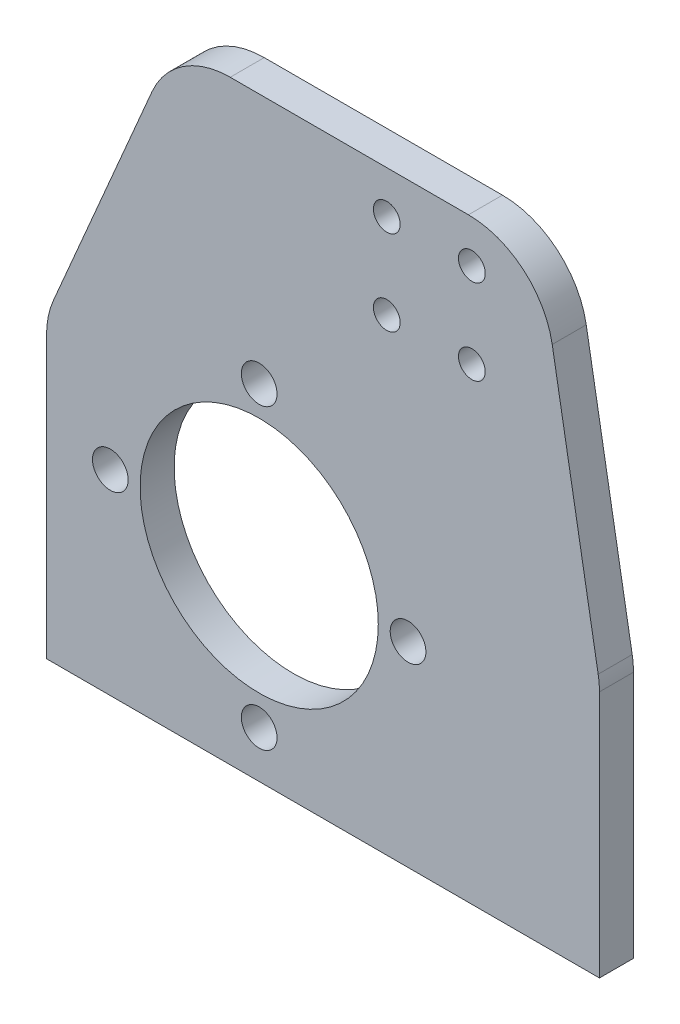
ISO-10303-21;
HEADER;
FILE_DESCRIPTION(('STEP AP214'),'2;1');
FILE_NAME('part.step','',(''),(''),'','','');
FILE_SCHEMA(('AUTOMOTIVE_DESIGN { 1 0 10303 214 1 1 1 1 }'));
ENDSEC;
DATA;
#1=APPLICATION_CONTEXT('core data for automotive mechanical design processes');
#2=APPLICATION_PROTOCOL_DEFINITION('international standard','automotive_design',2000,#1);
#3=PRODUCT_CONTEXT('',#1,'mechanical');
#4=PRODUCT('Part','Part','',(#3));
#5=PRODUCT_RELATED_PRODUCT_CATEGORY('part','',(#4));
#6=PRODUCT_DEFINITION_FORMATION('','',#4);
#7=PRODUCT_DEFINITION_CONTEXT('part definition',#1,'design');
#8=PRODUCT_DEFINITION('design','',#6,#7);
#9=PRODUCT_DEFINITION_SHAPE('','',#8);
#10=(LENGTH_UNIT() NAMED_UNIT(*) SI_UNIT(.MILLI.,.METRE.));
#11=(NAMED_UNIT(*) PLANE_ANGLE_UNIT() SI_UNIT($,.RADIAN.));
#12=(NAMED_UNIT(*) SI_UNIT($,.STERADIAN.) SOLID_ANGLE_UNIT());
#13=UNCERTAINTY_MEASURE_WITH_UNIT(LENGTH_MEASURE(1.E-05),#10,'distance_accuracy_value','');
#14=(GEOMETRIC_REPRESENTATION_CONTEXT(3) GLOBAL_UNCERTAINTY_ASSIGNED_CONTEXT((#13)) GLOBAL_UNIT_ASSIGNED_CONTEXT((#10,
#11,#12)) REPRESENTATION_CONTEXT('',''));
#15=CARTESIAN_POINT('',(0.,0.,0.));
#16=DIRECTION('',(0.,0.,1.));
#17=DIRECTION('',(1.,0.,0.));
#18=AXIS2_PLACEMENT_3D('',#15,#16,#17);
#19=CARTESIAN_POINT('',(0.,0.,4.));
#20=DIRECTION('',(1.,0.,0.));
#21=DIRECTION('',(0.,1.,0.));
#22=AXIS2_PLACEMENT_3D('',#19,#20,#21);
#23=PLANE('',#22);
#24=DIRECTION('',(0.,-1.,0.));
#25=VECTOR('',#24,1.);
#26=CARTESIAN_POINT('',(0.,0.,4.));
#27=LINE('',#26,#25);
#28=CARTESIAN_POINT('',(0.,-37.0525770195464,4.));
#29=VERTEX_POINT('',#28);
#30=CARTESIAN_POINT('',(0.,-70.,4.));
#31=VERTEX_POINT('',#30);
#32=EDGE_CURVE('E116',#29,#31,#27,.T.);
#33=ORIENTED_EDGE('',*,*,#32,.F.);
#34=DIRECTION('',(0.,0.,-1.));
#35=VECTOR('',#34,1.);
#36=CARTESIAN_POINT('',(0.,-37.0525770195464,4.));
#37=LINE('',#36,#35);
#38=CARTESIAN_POINT('',(0.,-37.0525770195464,0.));
#39=VERTEX_POINT('',#38);
#40=EDGE_CURVE('E174',#29,#39,#37,.T.);
#41=ORIENTED_EDGE('',*,*,#40,.T.);
#42=DIRECTION('',(0.,-1.,0.));
#43=VECTOR('',#42,1.);
#44=CARTESIAN_POINT('',(0.,0.,0.));
#45=LINE('',#44,#43);
#46=CARTESIAN_POINT('',(0.,-70.,0.));
#47=VERTEX_POINT('',#46);
#48=EDGE_CURVE('E142',#39,#47,#45,.T.);
#49=ORIENTED_EDGE('',*,*,#48,.T.);
#50=DIRECTION('',(0.,0.,-1.));
#51=VECTOR('',#50,1.);
#52=CARTESIAN_POINT('',(0.,-70.,4.));
#53=LINE('',#52,#51);
#54=EDGE_CURVE('E135',#31,#47,#53,.T.);
#55=ORIENTED_EDGE('',*,*,#54,.F.);
#56=EDGE_LOOP('',(#33,#41,#49,#55));
#57=FACE_BOUND('',#56,.T.);
#58=ADVANCED_FACE('F40',(#57),#23,.F.);
#59=CARTESIAN_POINT('',(0.,-70.,4.));
#60=DIRECTION('',(0.,1.,0.));
#61=DIRECTION('',(0.,0.,1.));
#62=AXIS2_PLACEMENT_3D('',#59,#60,#61);
#63=PLANE('',#62);
#64=DIRECTION('',(1.,0.,0.));
#65=VECTOR('',#64,1.);
#66=CARTESIAN_POINT('',(0.,-70.,0.));
#67=LINE('',#66,#65);
#68=CARTESIAN_POINT('',(65.,-70.,0.));
#69=VERTEX_POINT('',#68);
#70=EDGE_CURVE('E256',#47,#69,#67,.T.);
#71=ORIENTED_EDGE('',*,*,#70,.T.);
#72=DIRECTION('',(0.,0.,-1.));
#73=VECTOR('',#72,1.);
#74=CARTESIAN_POINT('',(65.,-70.,4.));
#75=LINE('',#74,#73);
#76=CARTESIAN_POINT('',(65.,-70.,4.));
#77=VERTEX_POINT('',#76);
#78=EDGE_CURVE('E137',#77,#69,#75,.T.);
#79=ORIENTED_EDGE('',*,*,#78,.F.);
#80=DIRECTION('',(1.,0.,0.));
#81=VECTOR('',#80,1.);
#82=CARTESIAN_POINT('',(0.,-70.,4.));
#83=LINE('',#82,#81);
#84=EDGE_CURVE('E121',#31,#77,#83,.T.);
#85=ORIENTED_EDGE('',*,*,#84,.F.);
#86=ORIENTED_EDGE('',*,*,#54,.T.);
#87=EDGE_LOOP('',(#71,#79,#85,#86));
#88=FACE_BOUND('',#87,.T.);
#89=ADVANCED_FACE('F134',(#88),#63,.F.);
#90=CARTESIAN_POINT('',(65.,0.,4.));
#91=DIRECTION('',(-1.,0.,0.));
#92=DIRECTION('',(0.,-1.,0.));
#93=AXIS2_PLACEMENT_3D('',#90,#91,#92);
#94=PLANE('',#93);
#95=DIRECTION('',(0.,1.,0.));
#96=VECTOR('',#95,1.);
#97=CARTESIAN_POINT('',(65.,0.,0.));
#98=LINE('',#97,#96);
#99=CARTESIAN_POINT('',(65.,-40.8684014407056,0.));
#100=VERTEX_POINT('',#99);
#101=EDGE_CURVE('E258',#69,#100,#98,.T.);
#102=ORIENTED_EDGE('',*,*,#101,.T.);
#103=DIRECTION('',(0.,0.,-1.));
#104=VECTOR('',#103,1.);
#105=CARTESIAN_POINT('',(65.,-40.8684014407056,4.));
#106=LINE('',#105,#104);
#107=CARTESIAN_POINT('',(65.,-40.8684014407056,4.));
#108=VERTEX_POINT('',#107);
#109=EDGE_CURVE('E162',#100,#108,#106,.F.);
#110=ORIENTED_EDGE('',*,*,#109,.T.);
#111=DIRECTION('',(0.,1.,0.));
#112=VECTOR('',#111,1.);
#113=CARTESIAN_POINT('',(65.,0.,4.));
#114=LINE('',#113,#112);
#115=EDGE_CURVE('E139',#77,#108,#114,.T.);
#116=ORIENTED_EDGE('',*,*,#115,.F.);
#117=ORIENTED_EDGE('',*,*,#78,.T.);
#118=EDGE_LOOP('',(#102,#110,#116,#117));
#119=FACE_BOUND('',#118,.T.);
#120=ADVANCED_FACE('F275',(#119),#94,.F.);
#121=CARTESIAN_POINT('',(0.,0.,4.));
#122=DIRECTION('',(0.,-1.,0.));
#123=DIRECTION('',(0.,0.,-1.));
#124=AXIS2_PLACEMENT_3D('',#121,#122,#123);
#125=PLANE('',#124);
#126=DIRECTION('',(-1.,0.,0.));
#127=VECTOR('',#126,1.);
#128=CARTESIAN_POINT('',(0.,0.,4.));
#129=LINE('',#128,#127);
#130=CARTESIAN_POINT('',(49.5980297478765,0.,4.));
#131=VERTEX_POINT('',#130);
#132=CARTESIAN_POINT('',(21.5939615798056,0.,4.));
#133=VERTEX_POINT('',#132);
#134=EDGE_CURVE('E148',#131,#133,#129,.T.);
#135=ORIENTED_EDGE('',*,*,#134,.F.);
#136=DIRECTION('',(0.,0.,-1.));
#137=VECTOR('',#136,1.);
#138=CARTESIAN_POINT('',(49.5980297478765,0.,4.));
#139=LINE('',#138,#137);
#140=CARTESIAN_POINT('',(49.5980297478765,0.,0.));
#141=VERTEX_POINT('',#140);
#142=EDGE_CURVE('E171',#131,#141,#139,.T.);
#143=ORIENTED_EDGE('',*,*,#142,.T.);
#144=DIRECTION('',(-1.,0.,0.));
#145=VECTOR('',#144,1.);
#146=CARTESIAN_POINT('',(0.,0.,0.));
#147=LINE('',#146,#145);
#148=CARTESIAN_POINT('',(21.5939615798056,0.,0.));
#149=VERTEX_POINT('',#148);
#150=EDGE_CURVE('E130',#141,#149,#147,.T.);
#151=ORIENTED_EDGE('',*,*,#150,.T.);
#152=DIRECTION('',(0.,0.,-1.));
#153=VECTOR('',#152,1.);
#154=CARTESIAN_POINT('',(21.5939615798056,0.,4.));
#155=LINE('',#154,#153);
#156=EDGE_CURVE('E55',#149,#133,#155,.F.);
#157=ORIENTED_EDGE('',*,*,#156,.T.);
#158=EDGE_LOOP('',(#135,#143,#151,#157));
#159=FACE_BOUND('',#158,.T.);
#160=ADVANCED_FACE('F260',(#159),#125,.F.);
#161=CARTESIAN_POINT('',(0.,0.,4.));
#162=DIRECTION('',(0.,0.,1.));
#163=DIRECTION('',(1.,0.,0.));
#164=AXIS2_PLACEMENT_3D('',#161,#162,#163);
#165=PLANE('',#164);
#166=ORIENTED_EDGE('',*,*,#115,.T.);
#167=CARTESIAN_POINT('',(55.,-40.8684014407056,4.));
#168=DIRECTION('',(0.,0.,1.));
#169=DIRECTION('',(1.,0.,0.));
#170=AXIS2_PLACEMENT_3D('',#167,#168,#169);
#171=CIRCLE('',#170,10.);
#172=CARTESIAN_POINT('',(64.8503046715571,-39.1445981231831,4.));
#173=VERTEX_POINT('',#172);
#174=EDGE_CURVE('E168',#108,#173,#171,.T.);
#175=ORIENTED_EDGE('',*,*,#174,.T.);
#176=DIRECTION('',(-0.172380331752248,0.985030467155704,0.));
#177=VECTOR('',#176,1.);
#178=CARTESIAN_POINT('',(58.,0.,4.));
#179=LINE('',#178,#177);
#180=CARTESIAN_POINT('',(59.4483344194336,-8.27619668247752,4.));
#181=VERTEX_POINT('',#180);
#182=EDGE_CURVE('E196',#173,#181,#179,.T.);
#183=ORIENTED_EDGE('',*,*,#182,.T.);
#184=CARTESIAN_POINT('',(49.5980297478765,-10.,4.));
#185=DIRECTION('',(0.,0.,1.));
#186=DIRECTION('',(1.,0.,0.));
#187=AXIS2_PLACEMENT_3D('',#184,#185,#186);
#188=CIRCLE('',#187,10.);
#189=EDGE_CURVE('E62',#181,#131,#188,.T.);
#190=ORIENTED_EDGE('',*,*,#189,.T.);
#191=ORIENTED_EDGE('',*,*,#134,.T.);
#192=CARTESIAN_POINT('',(21.5939615798056,-10.,4.));
#193=DIRECTION('',(0.,0.,1.));
#194=DIRECTION('',(1.,0.,0.));
#195=AXIS2_PLACEMENT_3D('',#192,#193,#194);
#196=CIRCLE('',#195,10.);
#197=CARTESIAN_POINT('',(12.402511279625,-6.06080701420832,4.));
#198=VERTEX_POINT('',#197);
#199=EDGE_CURVE('E164',#133,#198,#196,.T.);
#200=ORIENTED_EDGE('',*,*,#199,.T.);
#201=DIRECTION('',(-0.393919298579168,-0.919145030018058,0.));
#202=VECTOR('',#201,1.);
#203=CARTESIAN_POINT('',(0.,-35.,4.));
#204=LINE('',#203,#202);
#205=CARTESIAN_POINT('',(0.808549699819426,-33.1133840337547,4.));
#206=VERTEX_POINT('',#205);
#207=EDGE_CURVE('E184',#198,#206,#204,.T.);
#208=ORIENTED_EDGE('',*,*,#207,.T.);
#209=CARTESIAN_POINT('',(10.,-37.0525770195464,4.));
#210=DIRECTION('',(0.,0.,1.));
#211=DIRECTION('',(1.,0.,0.));
#212=AXIS2_PLACEMENT_3D('',#209,#210,#211);
#213=CIRCLE('',#212,10.);
#214=EDGE_CURVE('E125',#206,#29,#213,.T.);
#215=ORIENTED_EDGE('',*,*,#214,.T.);
#216=ORIENTED_EDGE('',*,*,#32,.T.);
#217=ORIENTED_EDGE('',*,*,#84,.T.);
#218=EDGE_LOOP('',(#166,#175,#183,#190,#191,#200,#208,#215,#216,#217));
#219=FACE_BOUND('',#218,.T.);
#220=CARTESIAN_POINT('',(7.50000000000002,-47.,4.));
#221=DIRECTION('',(0.,0.,1.));
#222=DIRECTION('',(1.,0.,0.));
#223=AXIS2_PLACEMENT_3D('',#220,#221,#222);
#224=CIRCLE('',#223,2.1);
#225=CARTESIAN_POINT('',(9.60000000000002,-47.,4.));
#226=VERTEX_POINT('',#225);
#227=EDGE_CURVE('E224',#226,#226,#224,.T.);
#228=ORIENTED_EDGE('',*,*,#227,.F.);
#229=EDGE_LOOP('',(#228));
#230=FACE_BOUND('',#229,.T.);
#231=CARTESIAN_POINT('',(25.,-64.5,4.));
#232=DIRECTION('',(0.,0.,1.));
#233=DIRECTION('',(-1.,0.,0.));
#234=AXIS2_PLACEMENT_3D('',#231,#232,#233);
#235=CIRCLE('',#234,2.1);
#236=CARTESIAN_POINT('',(22.9,-64.5,4.));
#237=VERTEX_POINT('',#236);
#238=EDGE_CURVE('E231',#237,#237,#235,.T.);
#239=ORIENTED_EDGE('',*,*,#238,.F.);
#240=EDGE_LOOP('',(#239));
#241=FACE_BOUND('',#240,.T.);
#242=CARTESIAN_POINT('',(42.5,-47.,4.));
#243=DIRECTION('',(0.,0.,1.));
#244=DIRECTION('',(-1.,0.,0.));
#245=AXIS2_PLACEMENT_3D('',#242,#243,#244);
#246=CIRCLE('',#245,2.1);
#247=CARTESIAN_POINT('',(40.4,-47.,4.));
#248=VERTEX_POINT('',#247);
#249=EDGE_CURVE('E237',#248,#248,#246,.T.);
#250=ORIENTED_EDGE('',*,*,#249,.F.);
#251=EDGE_LOOP('',(#250));
#252=FACE_BOUND('',#251,.T.);
#253=CARTESIAN_POINT('',(40.,-5.,4.));
#254=DIRECTION('',(0.,0.,1.));
#255=DIRECTION('',(1.,0.,0.));
#256=AXIS2_PLACEMENT_3D('',#253,#254,#255);
#257=CIRCLE('',#256,1.57499999999999);
#258=CARTESIAN_POINT('',(41.575,-5.,4.));
#259=VERTEX_POINT('',#258);
#260=EDGE_CURVE('E243',#259,#259,#257,.T.);
#261=ORIENTED_EDGE('',*,*,#260,.F.);
#262=EDGE_LOOP('',(#261));
#263=FACE_BOUND('',#262,.T.);
#264=CARTESIAN_POINT('',(50.,-5.,4.));
#265=DIRECTION('',(0.,0.,1.));
#266=DIRECTION('',(-1.,0.,0.));
#267=AXIS2_PLACEMENT_3D('',#264,#265,#266);
#268=CIRCLE('',#267,1.57499999999999);
#269=CARTESIAN_POINT('',(48.425,-5.,4.));
#270=VERTEX_POINT('',#269);
#271=EDGE_CURVE('E200',#270,#270,#268,.T.);
#272=ORIENTED_EDGE('',*,*,#271,.F.);
#273=EDGE_LOOP('',(#272));
#274=FACE_BOUND('',#273,.T.);
#275=CARTESIAN_POINT('',(50.,-15.,4.));
#276=DIRECTION('',(0.,0.,1.));
#277=DIRECTION('',(1.,0.,0.));
#278=AXIS2_PLACEMENT_3D('',#275,#276,#277);
#279=CIRCLE('',#278,1.57499999999999);
#280=CARTESIAN_POINT('',(51.575,-15.,4.));
#281=VERTEX_POINT('',#280);
#282=EDGE_CURVE('E207',#281,#281,#279,.T.);
#283=ORIENTED_EDGE('',*,*,#282,.F.);
#284=EDGE_LOOP('',(#283));
#285=FACE_BOUND('',#284,.T.);
#286=CARTESIAN_POINT('',(25.,-47.,4.));
#287=DIRECTION('',(0.,0.,1.));
#288=DIRECTION('',(1.,0.,0.));
#289=AXIS2_PLACEMENT_3D('',#286,#287,#288);
#290=CIRCLE('',#289,14.);
#291=CARTESIAN_POINT('',(39.,-47.,4.));
#292=VERTEX_POINT('',#291);
#293=EDGE_CURVE('E213',#292,#292,#290,.T.);
#294=ORIENTED_EDGE('',*,*,#293,.F.);
#295=EDGE_LOOP('',(#294));
#296=FACE_BOUND('',#295,.T.);
#297=CARTESIAN_POINT('',(40.,-15.,4.));
#298=DIRECTION('',(0.,0.,1.));
#299=DIRECTION('',(-1.,0.,0.));
#300=AXIS2_PLACEMENT_3D('',#297,#298,#299);
#301=CIRCLE('',#300,1.57499999999999);
#302=CARTESIAN_POINT('',(38.425,-15.,4.));
#303=VERTEX_POINT('',#302);
#304=EDGE_CURVE('E219',#303,#303,#301,.T.);
#305=ORIENTED_EDGE('',*,*,#304,.F.);
#306=EDGE_LOOP('',(#305));
#307=FACE_BOUND('',#306,.T.);
#308=CARTESIAN_POINT('',(25.,-29.5,4.));
#309=DIRECTION('',(0.,0.,1.));
#310=DIRECTION('',(1.,0.,0.));
#311=AXIS2_PLACEMENT_3D('',#308,#309,#310);
#312=CIRCLE('',#311,2.1);
#313=CARTESIAN_POINT('',(27.1,-29.5,4.));
#314=VERTEX_POINT('',#313);
#315=EDGE_CURVE('E227',#314,#314,#312,.T.);
#316=ORIENTED_EDGE('',*,*,#315,.F.);
#317=EDGE_LOOP('',(#316));
#318=FACE_BOUND('',#317,.T.);
#319=ADVANCED_FACE('F119',(#219,#230,#241,#252,#263,#274,#285,#296,#307,#318),#165,.T.);
#320=CARTESIAN_POINT('',(0.,0.,0.));
#321=DIRECTION('',(0.,0.,1.));
#322=DIRECTION('',(1.,0.,0.));
#323=AXIS2_PLACEMENT_3D('',#320,#321,#322);
#324=PLANE('',#323);
#325=CARTESIAN_POINT('',(7.50000000000002,-47.,0.));
#326=DIRECTION('',(0.,0.,1.));
#327=DIRECTION('',(1.,0.,0.));
#328=AXIS2_PLACEMENT_3D('',#325,#326,#327);
#329=CIRCLE('',#328,2.1);
#330=CARTESIAN_POINT('',(9.60000000000002,-47.,0.));
#331=VERTEX_POINT('',#330);
#332=EDGE_CURVE('E228',#331,#331,#329,.T.);
#333=ORIENTED_EDGE('',*,*,#332,.T.);
#334=EDGE_LOOP('',(#333));
#335=FACE_BOUND('',#334,.T.);
#336=CARTESIAN_POINT('',(25.,-64.5,0.));
#337=DIRECTION('',(0.,0.,1.));
#338=DIRECTION('',(-1.,0.,0.));
#339=AXIS2_PLACEMENT_3D('',#336,#337,#338);
#340=CIRCLE('',#339,2.1);
#341=CARTESIAN_POINT('',(22.9,-64.5,0.));
#342=VERTEX_POINT('',#341);
#343=EDGE_CURVE('E234',#342,#342,#340,.T.);
#344=ORIENTED_EDGE('',*,*,#343,.T.);
#345=EDGE_LOOP('',(#344));
#346=FACE_BOUND('',#345,.T.);
#347=CARTESIAN_POINT('',(42.5,-47.,0.));
#348=DIRECTION('',(0.,0.,1.));
#349=DIRECTION('',(-1.,0.,0.));
#350=AXIS2_PLACEMENT_3D('',#347,#348,#349);
#351=CIRCLE('',#350,2.1);
#352=CARTESIAN_POINT('',(40.4,-47.,0.));
#353=VERTEX_POINT('',#352);
#354=EDGE_CURVE('E240',#353,#353,#351,.T.);
#355=ORIENTED_EDGE('',*,*,#354,.T.);
#356=EDGE_LOOP('',(#355));
#357=FACE_BOUND('',#356,.T.);
#358=CARTESIAN_POINT('',(40.,-5.,0.));
#359=DIRECTION('',(0.,0.,1.));
#360=DIRECTION('',(1.,0.,0.));
#361=AXIS2_PLACEMENT_3D('',#358,#359,#360);
#362=CIRCLE('',#361,1.57499999999999);
#363=CARTESIAN_POINT('',(41.575,-5.,0.));
#364=VERTEX_POINT('',#363);
#365=EDGE_CURVE('E203',#364,#364,#362,.T.);
#366=ORIENTED_EDGE('',*,*,#365,.T.);
#367=EDGE_LOOP('',(#366));
#368=FACE_BOUND('',#367,.T.);
#369=CARTESIAN_POINT('',(50.,-5.,0.));
#370=DIRECTION('',(0.,0.,1.));
#371=DIRECTION('',(-1.,0.,0.));
#372=AXIS2_PLACEMENT_3D('',#369,#370,#371);
#373=CIRCLE('',#372,1.57499999999999);
#374=CARTESIAN_POINT('',(48.425,-5.,0.));
#375=VERTEX_POINT('',#374);
#376=EDGE_CURVE('E204',#375,#375,#373,.T.);
#377=ORIENTED_EDGE('',*,*,#376,.T.);
#378=EDGE_LOOP('',(#377));
#379=FACE_BOUND('',#378,.T.);
#380=CARTESIAN_POINT('',(50.,-15.,0.));
#381=DIRECTION('',(0.,0.,1.));
#382=DIRECTION('',(1.,0.,0.));
#383=AXIS2_PLACEMENT_3D('',#380,#381,#382);
#384=CIRCLE('',#383,1.57499999999999);
#385=CARTESIAN_POINT('',(51.575,-15.,0.));
#386=VERTEX_POINT('',#385);
#387=EDGE_CURVE('E210',#386,#386,#384,.T.);
#388=ORIENTED_EDGE('',*,*,#387,.T.);
#389=EDGE_LOOP('',(#388));
#390=FACE_BOUND('',#389,.T.);
#391=CARTESIAN_POINT('',(25.,-47.,0.));
#392=DIRECTION('',(0.,0.,1.));
#393=DIRECTION('',(1.,0.,0.));
#394=AXIS2_PLACEMENT_3D('',#391,#392,#393);
#395=CIRCLE('',#394,14.);
#396=CARTESIAN_POINT('',(39.,-47.,0.));
#397=VERTEX_POINT('',#396);
#398=EDGE_CURVE('E216',#397,#397,#395,.T.);
#399=ORIENTED_EDGE('',*,*,#398,.T.);
#400=EDGE_LOOP('',(#399));
#401=FACE_BOUND('',#400,.T.);
#402=CARTESIAN_POINT('',(40.,-15.,0.));
#403=DIRECTION('',(0.,0.,1.));
#404=DIRECTION('',(-1.,0.,0.));
#405=AXIS2_PLACEMENT_3D('',#402,#403,#404);
#406=CIRCLE('',#405,1.57499999999999);
#407=CARTESIAN_POINT('',(38.425,-15.,0.));
#408=VERTEX_POINT('',#407);
#409=EDGE_CURVE('E193',#408,#408,#406,.T.);
#410=ORIENTED_EDGE('',*,*,#409,.T.);
#411=EDGE_LOOP('',(#410));
#412=FACE_BOUND('',#411,.T.);
#413=CARTESIAN_POINT('',(25.,-29.5,0.));
#414=DIRECTION('',(0.,0.,1.));
#415=DIRECTION('',(1.,0.,0.));
#416=AXIS2_PLACEMENT_3D('',#413,#414,#415);
#417=CIRCLE('',#416,2.1);
#418=CARTESIAN_POINT('',(27.1,-29.5,0.));
#419=VERTEX_POINT('',#418);
#420=EDGE_CURVE('E248',#419,#419,#417,.T.);
#421=ORIENTED_EDGE('',*,*,#420,.T.);
#422=EDGE_LOOP('',(#421));
#423=FACE_BOUND('',#422,.T.);
#424=DIRECTION('',(-0.172380331752248,0.985030467155704,0.));
#425=VECTOR('',#424,1.);
#426=CARTESIAN_POINT('',(58.,0.,0.));
#427=LINE('',#426,#425);
#428=CARTESIAN_POINT('',(64.8503046715571,-39.1445981231831,0.));
#429=VERTEX_POINT('',#428);
#430=CARTESIAN_POINT('',(59.4483344194336,-8.27619668247752,0.));
#431=VERTEX_POINT('',#430);
#432=EDGE_CURVE('E191',#429,#431,#427,.T.);
#433=ORIENTED_EDGE('',*,*,#432,.F.);
#434=CARTESIAN_POINT('',(55.,-40.8684014407056,0.));
#435=DIRECTION('',(0.,0.,1.));
#436=DIRECTION('',(1.,0.,0.));
#437=AXIS2_PLACEMENT_3D('',#434,#435,#436);
#438=CIRCLE('',#437,10.);
#439=EDGE_CURVE('E160',#429,#100,#438,.F.);
#440=ORIENTED_EDGE('',*,*,#439,.T.);
#441=ORIENTED_EDGE('',*,*,#101,.F.);
#442=ORIENTED_EDGE('',*,*,#70,.F.);
#443=ORIENTED_EDGE('',*,*,#48,.F.);
#444=CARTESIAN_POINT('',(10.,-37.0525770195464,0.));
#445=DIRECTION('',(0.,0.,1.));
#446=DIRECTION('',(1.,0.,0.));
#447=AXIS2_PLACEMENT_3D('',#444,#445,#446);
#448=CIRCLE('',#447,10.);
#449=CARTESIAN_POINT('',(0.808549699819426,-33.1133840337547,0.));
#450=VERTEX_POINT('',#449);
#451=EDGE_CURVE('E156',#39,#450,#448,.F.);
#452=ORIENTED_EDGE('',*,*,#451,.T.);
#453=DIRECTION('',(-0.393919298579168,-0.919145030018058,0.));
#454=VECTOR('',#453,1.);
#455=CARTESIAN_POINT('',(0.,-35.,0.));
#456=LINE('',#455,#454);
#457=CARTESIAN_POINT('',(12.402511279625,-6.06080701420832,0.));
#458=VERTEX_POINT('',#457);
#459=EDGE_CURVE('E182',#458,#450,#456,.T.);
#460=ORIENTED_EDGE('',*,*,#459,.F.);
#461=CARTESIAN_POINT('',(21.5939615798056,-10.,0.));
#462=DIRECTION('',(0.,0.,1.));
#463=DIRECTION('',(1.,0.,0.));
#464=AXIS2_PLACEMENT_3D('',#461,#462,#463);
#465=CIRCLE('',#464,10.);
#466=EDGE_CURVE('E154',#458,#149,#465,.F.);
#467=ORIENTED_EDGE('',*,*,#466,.T.);
#468=ORIENTED_EDGE('',*,*,#150,.F.);
#469=CARTESIAN_POINT('',(49.5980297478765,-10.,0.));
#470=DIRECTION('',(0.,0.,1.));
#471=DIRECTION('',(1.,0.,0.));
#472=AXIS2_PLACEMENT_3D('',#469,#470,#471);
#473=CIRCLE('',#472,10.);
#474=EDGE_CURVE('E158',#141,#431,#473,.F.);
#475=ORIENTED_EDGE('',*,*,#474,.T.);
#476=EDGE_LOOP('',(#433,#440,#441,#442,#443,#452,#460,#467,#468,#475));
#477=FACE_BOUND('',#476,.T.);
#478=ADVANCED_FACE('F189',(#335,#346,#357,#368,#379,#390,#401,#412,#423,#477),#324,.F.);
#479=CARTESIAN_POINT('',(25.,-29.5,0.));
#480=DIRECTION('',(0.,0.,1.));
#481=DIRECTION('',(1.,0.,0.));
#482=AXIS2_PLACEMENT_3D('',#479,#480,#481);
#483=CYLINDRICAL_SURFACE('',#482,2.1);
#484=ORIENTED_EDGE('',*,*,#420,.F.);
#485=EDGE_LOOP('',(#484));
#486=FACE_BOUND('',#485,.T.);
#487=ORIENTED_EDGE('',*,*,#315,.T.);
#488=EDGE_LOOP('',(#487));
#489=FACE_BOUND('',#488,.T.);
#490=ADVANCED_FACE('F350',(#486,#489),#483,.F.);
#491=CARTESIAN_POINT('',(40.,-15.,0.));
#492=DIRECTION('',(0.,0.,1.));
#493=DIRECTION('',(1.,0.,0.));
#494=AXIS2_PLACEMENT_3D('',#491,#492,#493);
#495=CYLINDRICAL_SURFACE('',#494,1.57499999999999);
#496=ORIENTED_EDGE('',*,*,#409,.F.);
#497=EDGE_LOOP('',(#496));
#498=FACE_BOUND('',#497,.T.);
#499=ORIENTED_EDGE('',*,*,#304,.T.);
#500=EDGE_LOOP('',(#499));
#501=FACE_BOUND('',#500,.T.);
#502=ADVANCED_FACE('F454',(#498,#501),#495,.F.);
#503=CARTESIAN_POINT('',(25.,-47.,0.));
#504=DIRECTION('',(0.,0.,1.));
#505=DIRECTION('',(1.,0.,0.));
#506=AXIS2_PLACEMENT_3D('',#503,#504,#505);
#507=CYLINDRICAL_SURFACE('',#506,14.);
#508=ORIENTED_EDGE('',*,*,#398,.F.);
#509=EDGE_LOOP('',(#508));
#510=FACE_BOUND('',#509,.T.);
#511=ORIENTED_EDGE('',*,*,#293,.T.);
#512=EDGE_LOOP('',(#511));
#513=FACE_BOUND('',#512,.T.);
#514=ADVANCED_FACE('F443',(#510,#513),#507,.F.);
#515=CARTESIAN_POINT('',(50.,-15.,0.));
#516=DIRECTION('',(0.,0.,1.));
#517=DIRECTION('',(1.,0.,0.));
#518=AXIS2_PLACEMENT_3D('',#515,#516,#517);
#519=CYLINDRICAL_SURFACE('',#518,1.57499999999999);
#520=ORIENTED_EDGE('',*,*,#387,.F.);
#521=EDGE_LOOP('',(#520));
#522=FACE_BOUND('',#521,.T.);
#523=ORIENTED_EDGE('',*,*,#282,.T.);
#524=EDGE_LOOP('',(#523));
#525=FACE_BOUND('',#524,.T.);
#526=ADVANCED_FACE('F432',(#522,#525),#519,.F.);
#527=CARTESIAN_POINT('',(50.,-5.,0.));
#528=DIRECTION('',(0.,0.,1.));
#529=DIRECTION('',(1.,0.,0.));
#530=AXIS2_PLACEMENT_3D('',#527,#528,#529);
#531=CYLINDRICAL_SURFACE('',#530,1.57499999999999);
#532=ORIENTED_EDGE('',*,*,#376,.F.);
#533=EDGE_LOOP('',(#532));
#534=FACE_BOUND('',#533,.T.);
#535=ORIENTED_EDGE('',*,*,#271,.T.);
#536=EDGE_LOOP('',(#535));
#537=FACE_BOUND('',#536,.T.);
#538=ADVANCED_FACE('F421',(#534,#537),#531,.F.);
#539=CARTESIAN_POINT('',(40.,-5.,0.));
#540=DIRECTION('',(0.,0.,1.));
#541=DIRECTION('',(1.,0.,0.));
#542=AXIS2_PLACEMENT_3D('',#539,#540,#541);
#543=CYLINDRICAL_SURFACE('',#542,1.57499999999999);
#544=ORIENTED_EDGE('',*,*,#365,.F.);
#545=EDGE_LOOP('',(#544));
#546=FACE_BOUND('',#545,.T.);
#547=ORIENTED_EDGE('',*,*,#260,.T.);
#548=EDGE_LOOP('',(#547));
#549=FACE_BOUND('',#548,.T.);
#550=ADVANCED_FACE('F410',(#546,#549),#543,.F.);
#551=CARTESIAN_POINT('',(42.5,-47.,0.));
#552=DIRECTION('',(0.,0.,1.));
#553=DIRECTION('',(1.,0.,0.));
#554=AXIS2_PLACEMENT_3D('',#551,#552,#553);
#555=CYLINDRICAL_SURFACE('',#554,2.1);
#556=ORIENTED_EDGE('',*,*,#354,.F.);
#557=EDGE_LOOP('',(#556));
#558=FACE_BOUND('',#557,.T.);
#559=ORIENTED_EDGE('',*,*,#249,.T.);
#560=EDGE_LOOP('',(#559));
#561=FACE_BOUND('',#560,.T.);
#562=ADVANCED_FACE('F399',(#558,#561),#555,.F.);
#563=CARTESIAN_POINT('',(25.,-64.5,0.));
#564=DIRECTION('',(0.,0.,1.));
#565=DIRECTION('',(1.,0.,0.));
#566=AXIS2_PLACEMENT_3D('',#563,#564,#565);
#567=CYLINDRICAL_SURFACE('',#566,2.1);
#568=ORIENTED_EDGE('',*,*,#343,.F.);
#569=EDGE_LOOP('',(#568));
#570=FACE_BOUND('',#569,.T.);
#571=ORIENTED_EDGE('',*,*,#238,.T.);
#572=EDGE_LOOP('',(#571));
#573=FACE_BOUND('',#572,.T.);
#574=ADVANCED_FACE('F388',(#570,#573),#567,.F.);
#575=CARTESIAN_POINT('',(7.50000000000002,-47.,0.));
#576=DIRECTION('',(0.,0.,1.));
#577=DIRECTION('',(1.,0.,0.));
#578=AXIS2_PLACEMENT_3D('',#575,#576,#577);
#579=CYLINDRICAL_SURFACE('',#578,2.1);
#580=ORIENTED_EDGE('',*,*,#332,.F.);
#581=EDGE_LOOP('',(#580));
#582=FACE_BOUND('',#581,.T.);
#583=ORIENTED_EDGE('',*,*,#227,.T.);
#584=EDGE_LOOP('',(#583));
#585=FACE_BOUND('',#584,.T.);
#586=ADVANCED_FACE('F338',(#582,#585),#579,.F.);
#587=CARTESIAN_POINT('',(58.,0.,4.));
#588=DIRECTION('',(-0.985030467155704,-0.172380331752248,0.));
#589=DIRECTION('',(0.172380331752248,-0.985030467155704,0.));
#590=AXIS2_PLACEMENT_3D('',#587,#588,#589);
#591=PLANE('',#590);
#592=ORIENTED_EDGE('',*,*,#182,.F.);
#593=DIRECTION('',(0.,0.,-1.));
#594=VECTOR('',#593,1.);
#595=CARTESIAN_POINT('',(64.8503046715571,-39.1445981231831,4.));
#596=LINE('',#595,#594);
#597=EDGE_CURVE('E146',#173,#429,#596,.T.);
#598=ORIENTED_EDGE('',*,*,#597,.T.);
#599=ORIENTED_EDGE('',*,*,#432,.T.);
#600=DIRECTION('',(0.,0.,-1.));
#601=VECTOR('',#600,1.);
#602=CARTESIAN_POINT('',(59.4483344194336,-8.27619668247752,4.));
#603=LINE('',#602,#601);
#604=EDGE_CURVE('E144',#431,#181,#603,.F.);
#605=ORIENTED_EDGE('',*,*,#604,.T.);
#606=EDGE_LOOP('',(#592,#598,#599,#605));
#607=FACE_BOUND('',#606,.T.);
#608=ADVANCED_FACE('F267',(#607),#591,.F.);
#609=CARTESIAN_POINT('',(0.,-35.,4.));
#610=DIRECTION('',(0.919145030018058,-0.393919298579168,0.));
#611=DIRECTION('',(0.393919298579168,0.919145030018058,0.));
#612=AXIS2_PLACEMENT_3D('',#609,#610,#611);
#613=PLANE('',#612);
#614=ORIENTED_EDGE('',*,*,#459,.T.);
#615=DIRECTION('',(0.,0.,-1.));
#616=VECTOR('',#615,1.);
#617=CARTESIAN_POINT('',(0.808549699819426,-33.1133840337547,4.));
#618=LINE('',#617,#616);
#619=EDGE_CURVE('E11',#450,#206,#618,.F.);
#620=ORIENTED_EDGE('',*,*,#619,.T.);
#621=ORIENTED_EDGE('',*,*,#207,.F.);
#622=DIRECTION('',(0.,0.,-1.));
#623=VECTOR('',#622,1.);
#624=CARTESIAN_POINT('',(12.402511279625,-6.06080701420832,4.));
#625=LINE('',#624,#623);
#626=EDGE_CURVE('E48',#198,#458,#625,.T.);
#627=ORIENTED_EDGE('',*,*,#626,.T.);
#628=EDGE_LOOP('',(#614,#620,#621,#627));
#629=FACE_BOUND('',#628,.T.);
#630=ADVANCED_FACE('F181',(#629),#613,.F.);
#631=CARTESIAN_POINT('',(55.,-40.8684014407056,4.));
#632=DIRECTION('',(0.,0.,-1.));
#633=DIRECTION('',(-1.,0.,0.));
#634=AXIS2_PLACEMENT_3D('',#631,#632,#633);
#635=CYLINDRICAL_SURFACE('',#634,10.);
#636=ORIENTED_EDGE('',*,*,#174,.F.);
#637=ORIENTED_EDGE('',*,*,#109,.F.);
#638=ORIENTED_EDGE('',*,*,#439,.F.);
#639=ORIENTED_EDGE('',*,*,#597,.F.);
#640=EDGE_LOOP('',(#636,#637,#638,#639));
#641=FACE_BOUND('',#640,.T.);
#642=ADVANCED_FACE('F271',(#641),#635,.T.);
#643=CARTESIAN_POINT('',(49.5980297478765,-10.,4.));
#644=DIRECTION('',(0.,0.,-1.));
#645=DIRECTION('',(-1.,0.,0.));
#646=AXIS2_PLACEMENT_3D('',#643,#644,#645);
#647=CYLINDRICAL_SURFACE('',#646,10.);
#648=ORIENTED_EDGE('',*,*,#189,.F.);
#649=ORIENTED_EDGE('',*,*,#604,.F.);
#650=ORIENTED_EDGE('',*,*,#474,.F.);
#651=ORIENTED_EDGE('',*,*,#142,.F.);
#652=EDGE_LOOP('',(#648,#649,#650,#651));
#653=FACE_BOUND('',#652,.T.);
#654=ADVANCED_FACE('F263',(#653),#647,.T.);
#655=CARTESIAN_POINT('',(10.,-37.0525770195464,4.));
#656=DIRECTION('',(0.,0.,-1.));
#657=DIRECTION('',(-1.,0.,0.));
#658=AXIS2_PLACEMENT_3D('',#655,#656,#657);
#659=CYLINDRICAL_SURFACE('',#658,10.);
#660=ORIENTED_EDGE('',*,*,#214,.F.);
#661=ORIENTED_EDGE('',*,*,#619,.F.);
#662=ORIENTED_EDGE('',*,*,#451,.F.);
#663=ORIENTED_EDGE('',*,*,#40,.F.);
#664=EDGE_LOOP('',(#660,#661,#662,#663));
#665=FACE_BOUND('',#664,.T.);
#666=ADVANCED_FACE('F292',(#665),#659,.T.);
#667=CARTESIAN_POINT('',(21.5939615798056,-10.,4.));
#668=DIRECTION('',(0.,0.,-1.));
#669=DIRECTION('',(-1.,0.,0.));
#670=AXIS2_PLACEMENT_3D('',#667,#668,#669);
#671=CYLINDRICAL_SURFACE('',#670,10.);
#672=ORIENTED_EDGE('',*,*,#199,.F.);
#673=ORIENTED_EDGE('',*,*,#156,.F.);
#674=ORIENTED_EDGE('',*,*,#466,.F.);
#675=ORIENTED_EDGE('',*,*,#626,.F.);
#676=EDGE_LOOP('',(#672,#673,#674,#675));
#677=FACE_BOUND('',#676,.T.);
#678=ADVANCED_FACE('F42',(#677),#671,.T.);
#679=CLOSED_SHELL('',(#58,#89,#120,#160,#319,#478,#490,#502,#514,#526,#538,#550,#562,#574,#586,
#608,#630,#642,#654,#666,#678));
#680=MANIFOLD_SOLID_BREP('B2',#679);
#681=ADVANCED_BREP_SHAPE_REPRESENTATION('',(#18,#680),#14);
#682=SHAPE_DEFINITION_REPRESENTATION(#9,#681);
ENDSEC;
END-ISO-10303-21;
